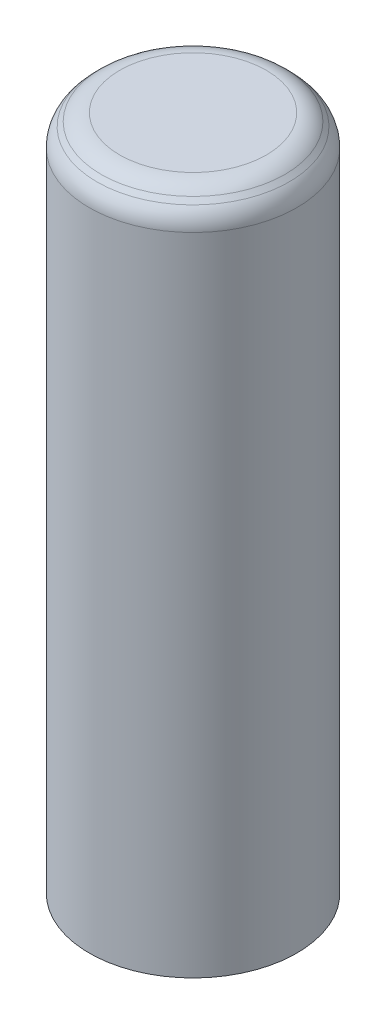
ISO-10303-21;
HEADER;
FILE_DESCRIPTION(('STEP AP214'),'2;1');
FILE_NAME('part.step','',(''),(''),'','','');
FILE_SCHEMA(('AUTOMOTIVE_DESIGN { 1 0 10303 214 1 1 1 1 }'));
ENDSEC;
DATA;
#1=APPLICATION_CONTEXT('core data for automotive mechanical design processes');
#2=APPLICATION_PROTOCOL_DEFINITION('international standard','automotive_design',2000,#1);
#3=PRODUCT_CONTEXT('',#1,'mechanical');
#4=PRODUCT('Part','Part','',(#3));
#5=PRODUCT_RELATED_PRODUCT_CATEGORY('part','',(#4));
#6=PRODUCT_DEFINITION_FORMATION('','',#4);
#7=PRODUCT_DEFINITION_CONTEXT('part definition',#1,'design');
#8=PRODUCT_DEFINITION('design','',#6,#7);
#9=PRODUCT_DEFINITION_SHAPE('','',#8);
#10=(LENGTH_UNIT() NAMED_UNIT(*) SI_UNIT(.MILLI.,.METRE.));
#11=(NAMED_UNIT(*) PLANE_ANGLE_UNIT() SI_UNIT($,.RADIAN.));
#12=(NAMED_UNIT(*) SI_UNIT($,.STERADIAN.) SOLID_ANGLE_UNIT());
#13=UNCERTAINTY_MEASURE_WITH_UNIT(LENGTH_MEASURE(1.E-05),#10,'distance_accuracy_value','');
#14=(GEOMETRIC_REPRESENTATION_CONTEXT(3) GLOBAL_UNCERTAINTY_ASSIGNED_CONTEXT((#13)) GLOBAL_UNIT_ASSIGNED_CONTEXT((#10,
#11,#12)) REPRESENTATION_CONTEXT('',''));
#15=CARTESIAN_POINT('',(0.,0.,0.));
#16=DIRECTION('',(0.,0.,1.));
#17=DIRECTION('',(1.,0.,0.));
#18=AXIS2_PLACEMENT_3D('',#15,#16,#17);
#19=CARTESIAN_POINT('',(0.,10.34,0.));
#20=DIRECTION('',(0.,1.,0.));
#21=DIRECTION('',(0.,0.,1.));
#22=AXIS2_PLACEMENT_3D('',#19,#20,#21);
#23=PLANE('',#22);
#24=CARTESIAN_POINT('',(0.,10.34,0.));
#25=DIRECTION('',(0.,-1.,0.));
#26=DIRECTION('',(0.,0.,1.));
#27=AXIS2_PLACEMENT_3D('',#24,#25,#26);
#28=CIRCLE('',#27,1.121814575051);
#29=CARTESIAN_POINT('',(0.,10.34,1.121814575051));
#30=VERTEX_POINT('',#29);
#31=CARTESIAN_POINT('',(0.,10.34,-1.121814575051));
#32=VERTEX_POINT('',#31);
#33=EDGE_CURVE('E39',#30,#32,#28,.T.);
#34=ORIENTED_EDGE('',*,*,#33,.F.);
#35=CARTESIAN_POINT('',(0.,10.34,0.));
#36=DIRECTION('',(0.,-1.,0.));
#37=DIRECTION('',(0.,0.,-1.));
#38=AXIS2_PLACEMENT_3D('',#35,#36,#37);
#39=CIRCLE('',#38,1.121814575051);
#40=EDGE_CURVE('E33',#32,#30,#39,.T.);
#41=ORIENTED_EDGE('',*,*,#40,.F.);
#42=EDGE_LOOP('',(#34,#41));
#43=FACE_BOUND('',#42,.T.);
#44=ADVANCED_FACE('F16',(#43),#23,.T.);
#45=CARTESIAN_POINT('',(0.,9.94,0.));
#46=DIRECTION('',(0.,1.,0.));
#47=DIRECTION('',(0.,0.,1.));
#48=AXIS2_PLACEMENT_3D('',#45,#46,#47);
#49=TOROIDAL_SURFACE('',#48,1.121814575051,0.4);
#50=ORIENTED_EDGE('',*,*,#40,.T.);
#51=ORIENTED_EDGE('',*,*,#33,.T.);
#52=EDGE_LOOP('',(#50,#51));
#53=FACE_BOUND('',#52,.T.);
#54=CARTESIAN_POINT('',(0.,10.2228427124373,0.));
#55=DIRECTION('',(0.,-1.,0.));
#56=DIRECTION('',(0.,0.,-1.));
#57=AXIS2_PLACEMENT_3D('',#54,#55,#56);
#58=CIRCLE('',#57,1.4046572874804);
#59=CARTESIAN_POINT('',(0.,10.2228427124373,-1.4046572874804));
#60=VERTEX_POINT('',#59);
#61=EDGE_CURVE('E42',#60,#60,#58,.T.);
#62=ORIENTED_EDGE('',*,*,#61,.F.);
#63=EDGE_LOOP('',(#62));
#64=FACE_BOUND('',#63,.T.);
#65=ADVANCED_FACE('F37',(#53,#64),#49,.T.);
#66=CARTESIAN_POINT('',(0.,10.1571572875514,0.));
#67=DIRECTION('',(0.,-1.,0.));
#68=DIRECTION('',(0.,0.,-1.));
#69=AXIS2_PLACEMENT_3D('',#66,#67,#68);
#70=CONICAL_SURFACE('',#69,1.47034271236635,0.785398162964754);
#71=CARTESIAN_POINT('',(0.,10.1571572875276,0.));
#72=DIRECTION('',(0.,1.,0.));
#73=DIRECTION('',(0.,0.,1.));
#74=AXIS2_PLACEMENT_3D('',#71,#72,#73);
#75=CIRCLE('',#74,1.47034271247262);
#76=CARTESIAN_POINT('',(0.,10.1571572875276,1.47034271247262));
#77=VERTEX_POINT('',#76);
#78=EDGE_CURVE('E88',#77,#77,#75,.F.);
#79=ORIENTED_EDGE('',*,*,#78,.F.);
#80=EDGE_LOOP('',(#79));
#81=FACE_BOUND('',#80,.T.);
#82=ORIENTED_EDGE('',*,*,#61,.T.);
#83=EDGE_LOOP('',(#82));
#84=FACE_BOUND('',#83,.T.);
#85=ADVANCED_FACE('F73',(#81,#84),#70,.T.);
#86=CARTESIAN_POINT('',(0.,9.874314575051,0.));
#87=DIRECTION('',(0.,1.,0.));
#88=DIRECTION('',(0.,0.,1.));
#89=AXIS2_PLACEMENT_3D('',#86,#87,#88);
#90=TOROIDAL_SURFACE('',#89,1.1875,0.4);
#91=ORIENTED_EDGE('',*,*,#78,.T.);
#92=EDGE_LOOP('',(#91));
#93=FACE_BOUND('',#92,.T.);
#94=CARTESIAN_POINT('',(0.,9.874314575051,0.));
#95=DIRECTION('',(0.,-1.,0.));
#96=DIRECTION('',(0.,0.,-1.));
#97=AXIS2_PLACEMENT_3D('',#94,#95,#96);
#98=CIRCLE('',#97,1.5875);
#99=CARTESIAN_POINT('',(0.,9.874314575051,-1.5875));
#100=VERTEX_POINT('',#99);
#101=EDGE_CURVE('E26',#100,#100,#98,.T.);
#102=ORIENTED_EDGE('',*,*,#101,.F.);
#103=EDGE_LOOP('',(#102));
#104=FACE_BOUND('',#103,.T.);
#105=ADVANCED_FACE('F77',(#93,#104),#90,.T.);
#106=CARTESIAN_POINT('',(0.,0.,0.));
#107=DIRECTION('',(0.,1.,0.));
#108=DIRECTION('',(0.,0.,1.));
#109=AXIS2_PLACEMENT_3D('',#106,#107,#108);
#110=PLANE('',#109);
#111=CARTESIAN_POINT('',(0.,0.,0.));
#112=DIRECTION('',(0.,-1.,0.));
#113=DIRECTION('',(0.,0.,-1.));
#114=AXIS2_PLACEMENT_3D('',#111,#112,#113);
#115=CIRCLE('',#114,1.5875);
#116=CARTESIAN_POINT('',(0.,0.,-1.5875));
#117=VERTEX_POINT('',#116);
#118=EDGE_CURVE('E11',#117,#117,#115,.F.);
#119=ORIENTED_EDGE('',*,*,#118,.F.);
#120=EDGE_LOOP('',(#119));
#121=FACE_BOUND('',#120,.T.);
#122=ADVANCED_FACE('F82',(#121),#110,.F.);
#123=CARTESIAN_POINT('',(0.,10.34,0.));
#124=DIRECTION('',(0.,-1.,0.));
#125=DIRECTION('',(0.,0.,-1.));
#126=AXIS2_PLACEMENT_3D('',#123,#124,#125);
#127=CYLINDRICAL_SURFACE('',#126,1.5875);
#128=ORIENTED_EDGE('',*,*,#118,.T.);
#129=EDGE_LOOP('',(#128));
#130=FACE_BOUND('',#129,.T.);
#131=ORIENTED_EDGE('',*,*,#101,.T.);
#132=EDGE_LOOP('',(#131));
#133=FACE_BOUND('',#132,.T.);
#134=ADVANCED_FACE('F97',(#130,#133),#127,.T.);
#135=CLOSED_SHELL('',(#44,#65,#85,#105,#122,#134));
#136=MANIFOLD_SOLID_BREP('B1',#135);
#137=ADVANCED_BREP_SHAPE_REPRESENTATION('',(#18,#136),#14);
#138=SHAPE_DEFINITION_REPRESENTATION(#9,#137);
ENDSEC;
END-ISO-10303-21;
